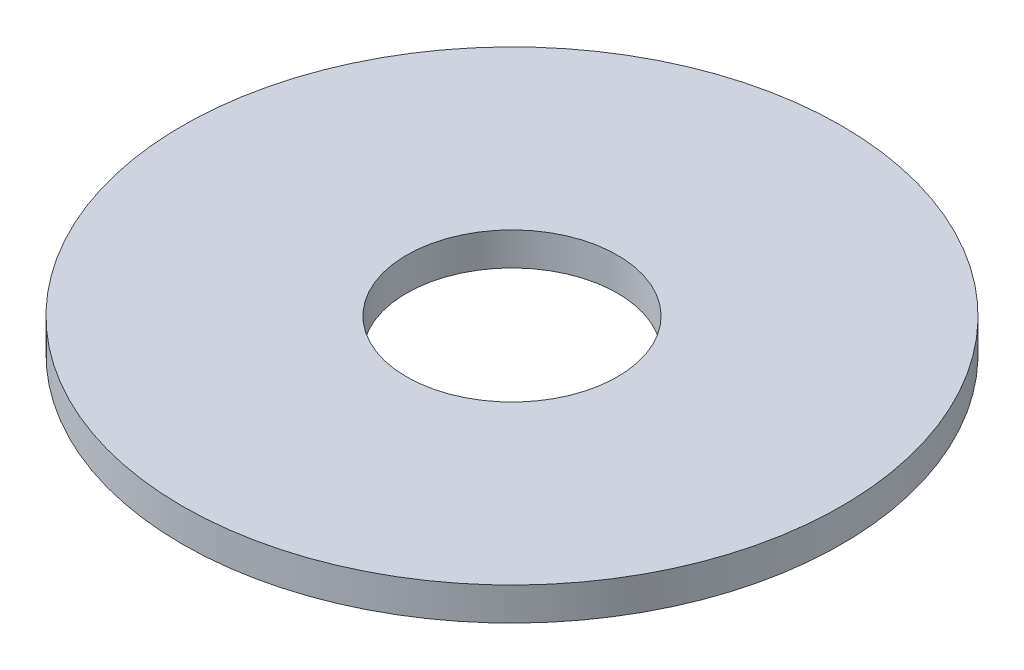
ISO-10303-21;
HEADER;
FILE_DESCRIPTION(('STEP AP214'),'2;1');
FILE_NAME('part.step','',(''),(''),'','','');
FILE_SCHEMA(('AUTOMOTIVE_DESIGN { 1 0 10303 214 1 1 1 1 }'));
ENDSEC;
DATA;
#1=APPLICATION_CONTEXT('core data for automotive mechanical design processes');
#2=APPLICATION_PROTOCOL_DEFINITION('international standard','automotive_design',2000,#1);
#3=PRODUCT_CONTEXT('',#1,'mechanical');
#4=PRODUCT('Part','Part','',(#3));
#5=PRODUCT_RELATED_PRODUCT_CATEGORY('part','',(#4));
#6=PRODUCT_DEFINITION_FORMATION('','',#4);
#7=PRODUCT_DEFINITION_CONTEXT('part definition',#1,'design');
#8=PRODUCT_DEFINITION('design','',#6,#7);
#9=PRODUCT_DEFINITION_SHAPE('','',#8);
#10=(LENGTH_UNIT() NAMED_UNIT(*) SI_UNIT(.MILLI.,.METRE.));
#11=(NAMED_UNIT(*) PLANE_ANGLE_UNIT() SI_UNIT($,.RADIAN.));
#12=(NAMED_UNIT(*) SI_UNIT($,.STERADIAN.) SOLID_ANGLE_UNIT());
#13=UNCERTAINTY_MEASURE_WITH_UNIT(LENGTH_MEASURE(1.E-05),#10,'distance_accuracy_value','');
#14=(GEOMETRIC_REPRESENTATION_CONTEXT(3) GLOBAL_UNCERTAINTY_ASSIGNED_CONTEXT((#13)) GLOBAL_UNIT_ASSIGNED_CONTEXT((#10,
#11,#12)) REPRESENTATION_CONTEXT('',''));
#15=CARTESIAN_POINT('',(0.,0.,0.));
#16=DIRECTION('',(0.,0.,1.));
#17=DIRECTION('',(1.,0.,0.));
#18=AXIS2_PLACEMENT_3D('',#15,#16,#17);
#19=CARTESIAN_POINT('',(0.,0.5,0.));
#20=DIRECTION('',(0.,1.,0.));
#21=DIRECTION('',(0.,0.,1.));
#22=AXIS2_PLACEMENT_3D('',#19,#20,#21);
#23=PLANE('',#22);
#24=CARTESIAN_POINT('',(0.,0.5,0.));
#25=DIRECTION('',(0.,1.,0.));
#26=DIRECTION('',(0.,0.,1.));
#27=AXIS2_PLACEMENT_3D('',#24,#25,#26);
#28=CIRCLE('',#27,5.);
#29=CARTESIAN_POINT('',(0.,0.5,5.));
#30=VERTEX_POINT('',#29);
#31=EDGE_CURVE('E10',#30,#30,#28,.T.);
#32=ORIENTED_EDGE('',*,*,#31,.T.);
#33=EDGE_LOOP('',(#32));
#34=FACE_BOUND('',#33,.T.);
#35=CARTESIAN_POINT('',(0.,0.5,0.));
#36=DIRECTION('',(0.,1.,0.));
#37=DIRECTION('',(0.,0.,1.));
#38=AXIS2_PLACEMENT_3D('',#35,#36,#37);
#39=CIRCLE('',#38,1.6);
#40=CARTESIAN_POINT('',(0.,0.5,1.6));
#41=VERTEX_POINT('',#40);
#42=EDGE_CURVE('E42',#41,#41,#39,.T.);
#43=ORIENTED_EDGE('',*,*,#42,.F.);
#44=EDGE_LOOP('',(#43));
#45=FACE_BOUND('',#44,.T.);
#46=ADVANCED_FACE('F31',(#34,#45),#23,.T.);
#47=CARTESIAN_POINT('',(0.,0.,0.));
#48=DIRECTION('',(0.,1.,0.));
#49=DIRECTION('',(0.,0.,1.));
#50=AXIS2_PLACEMENT_3D('',#47,#48,#49);
#51=PLANE('',#50);
#52=CARTESIAN_POINT('',(0.,0.,0.));
#53=DIRECTION('',(0.,1.,0.));
#54=DIRECTION('',(0.,0.,1.));
#55=AXIS2_PLACEMENT_3D('',#52,#53,#54);
#56=CIRCLE('',#55,5.);
#57=CARTESIAN_POINT('',(0.,0.,5.));
#58=VERTEX_POINT('',#57);
#59=EDGE_CURVE('E35',#58,#58,#56,.T.);
#60=ORIENTED_EDGE('',*,*,#59,.F.);
#61=EDGE_LOOP('',(#60));
#62=FACE_BOUND('',#61,.T.);
#63=CARTESIAN_POINT('',(0.,0.,0.));
#64=DIRECTION('',(0.,1.,0.));
#65=DIRECTION('',(0.,0.,1.));
#66=AXIS2_PLACEMENT_3D('',#63,#64,#65);
#67=CIRCLE('',#66,1.6);
#68=CARTESIAN_POINT('',(0.,0.,1.6));
#69=VERTEX_POINT('',#68);
#70=EDGE_CURVE('E44',#69,#69,#67,.T.);
#71=ORIENTED_EDGE('',*,*,#70,.T.);
#72=EDGE_LOOP('',(#71));
#73=FACE_BOUND('',#72,.T.);
#74=ADVANCED_FACE('F54',(#62,#73),#51,.F.);
#75=CARTESIAN_POINT('',(0.,0.5,0.));
#76=DIRECTION('',(0.,-1.,0.));
#77=DIRECTION('',(0.,0.,-1.));
#78=AXIS2_PLACEMENT_3D('',#75,#76,#77);
#79=CYLINDRICAL_SURFACE('',#78,5.);
#80=ORIENTED_EDGE('',*,*,#31,.F.);
#81=EDGE_LOOP('',(#80));
#82=FACE_BOUND('',#81,.T.);
#83=ORIENTED_EDGE('',*,*,#59,.T.);
#84=EDGE_LOOP('',(#83));
#85=FACE_BOUND('',#84,.T.);
#86=ADVANCED_FACE('F33',(#82,#85),#79,.T.);
#87=CARTESIAN_POINT('',(0.,0.5,0.));
#88=DIRECTION('',(0.,-1.,0.));
#89=DIRECTION('',(0.,0.,-1.));
#90=AXIS2_PLACEMENT_3D('',#87,#88,#89);
#91=CYLINDRICAL_SURFACE('',#90,1.6);
#92=ORIENTED_EDGE('',*,*,#42,.T.);
#93=EDGE_LOOP('',(#92));
#94=FACE_BOUND('',#93,.T.);
#95=ORIENTED_EDGE('',*,*,#70,.F.);
#96=EDGE_LOOP('',(#95));
#97=FACE_BOUND('',#96,.T.);
#98=ADVANCED_FACE('F50',(#94,#97),#91,.F.);
#99=CLOSED_SHELL('',(#46,#74,#86,#98));
#100=MANIFOLD_SOLID_BREP('B2',#99);
#101=ADVANCED_BREP_SHAPE_REPRESENTATION('',(#18,#100),#14);
#102=SHAPE_DEFINITION_REPRESENTATION(#9,#101);
ENDSEC;
END-ISO-10303-21;
